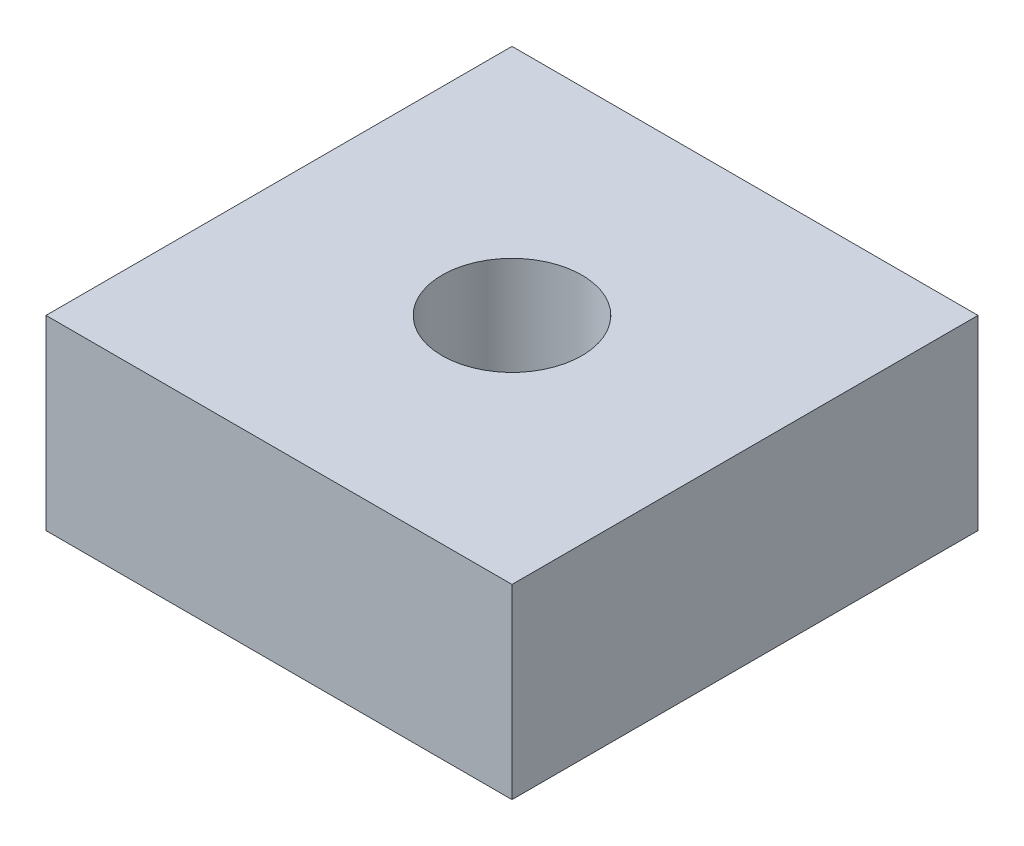
ISO-10303-21;
HEADER;
FILE_DESCRIPTION(('STEP AP214'),'2;1');
FILE_NAME('part.step','',(''),(''),'','','');
FILE_SCHEMA(('AUTOMOTIVE_DESIGN { 1 0 10303 214 1 1 1 1 }'));
ENDSEC;
DATA;
#1=APPLICATION_CONTEXT('core data for automotive mechanical design processes');
#2=APPLICATION_PROTOCOL_DEFINITION('international standard','automotive_design',2000,#1);
#3=PRODUCT_CONTEXT('',#1,'mechanical');
#4=PRODUCT('Part','Part','',(#3));
#5=PRODUCT_RELATED_PRODUCT_CATEGORY('part','',(#4));
#6=PRODUCT_DEFINITION_FORMATION('','',#4);
#7=PRODUCT_DEFINITION_CONTEXT('part definition',#1,'design');
#8=PRODUCT_DEFINITION('design','',#6,#7);
#9=PRODUCT_DEFINITION_SHAPE('','',#8);
#10=(LENGTH_UNIT() NAMED_UNIT(*) SI_UNIT(.MILLI.,.METRE.));
#11=(NAMED_UNIT(*) PLANE_ANGLE_UNIT() SI_UNIT($,.RADIAN.));
#12=(NAMED_UNIT(*) SI_UNIT($,.STERADIAN.) SOLID_ANGLE_UNIT());
#13=UNCERTAINTY_MEASURE_WITH_UNIT(LENGTH_MEASURE(1.E-05),#10,'distance_accuracy_value','');
#14=(GEOMETRIC_REPRESENTATION_CONTEXT(3) GLOBAL_UNCERTAINTY_ASSIGNED_CONTEXT((#13)) GLOBAL_UNIT_ASSIGNED_CONTEXT((#10,
#11,#12)) REPRESENTATION_CONTEXT('',''));
#15=CARTESIAN_POINT('',(0.,0.,0.));
#16=DIRECTION('',(0.,0.,1.));
#17=DIRECTION('',(1.,0.,0.));
#18=AXIS2_PLACEMENT_3D('',#15,#16,#17);
#19=CARTESIAN_POINT('',(0.,4.,0.));
#20=DIRECTION('',(0.,1.,0.));
#21=DIRECTION('',(0.,0.,1.));
#22=AXIS2_PLACEMENT_3D('',#19,#20,#21);
#23=PLANE('',#22);
#24=DIRECTION('',(0.,0.,-1.));
#25=VECTOR('',#24,1.);
#26=CARTESIAN_POINT('',(5.,4.,-5.));
#27=LINE('',#26,#25);
#28=CARTESIAN_POINT('',(5.,4.,5.));
#29=VERTEX_POINT('',#28);
#30=CARTESIAN_POINT('',(5.,4.,-5.));
#31=VERTEX_POINT('',#30);
#32=EDGE_CURVE('E85',#29,#31,#27,.T.);
#33=ORIENTED_EDGE('',*,*,#32,.T.);
#34=DIRECTION('',(-1.,0.,0.));
#35=VECTOR('',#34,1.);
#36=CARTESIAN_POINT('',(-5.,4.,-5.));
#37=LINE('',#36,#35);
#38=CARTESIAN_POINT('',(-5.,4.,-5.));
#39=VERTEX_POINT('',#38);
#40=EDGE_CURVE('E80',#31,#39,#37,.T.);
#41=ORIENTED_EDGE('',*,*,#40,.T.);
#42=DIRECTION('',(0.,0.,1.));
#43=VECTOR('',#42,1.);
#44=CARTESIAN_POINT('',(-5.,4.,-5.));
#45=LINE('',#44,#43);
#46=CARTESIAN_POINT('',(-5.,4.,5.));
#47=VERTEX_POINT('',#46);
#48=EDGE_CURVE('E83',#39,#47,#45,.T.);
#49=ORIENTED_EDGE('',*,*,#48,.T.);
#50=DIRECTION('',(1.,0.,0.));
#51=VECTOR('',#50,1.);
#52=CARTESIAN_POINT('',(-5.,4.,5.));
#53=LINE('',#52,#51);
#54=EDGE_CURVE('E50',#47,#29,#53,.T.);
#55=ORIENTED_EDGE('',*,*,#54,.T.);
#56=EDGE_LOOP('',(#33,#41,#49,#55));
#57=FACE_BOUND('',#56,.T.);
#58=CARTESIAN_POINT('',(0.,4.,0.));
#59=DIRECTION('',(0.,1.,0.));
#60=DIRECTION('',(0.,0.,1.));
#61=AXIS2_PLACEMENT_3D('',#58,#59,#60);
#62=CIRCLE('',#61,1.5);
#63=CARTESIAN_POINT('',(0.,4.,1.5));
#64=VERTEX_POINT('',#63);
#65=EDGE_CURVE('E100',#64,#64,#62,.T.);
#66=ORIENTED_EDGE('',*,*,#65,.F.);
#67=EDGE_LOOP('',(#66));
#68=FACE_BOUND('',#67,.T.);
#69=ADVANCED_FACE('F33',(#57,#68),#23,.T.);
#70=CARTESIAN_POINT('',(0.,0.,0.));
#71=DIRECTION('',(0.,1.,0.));
#72=DIRECTION('',(0.,0.,1.));
#73=AXIS2_PLACEMENT_3D('',#70,#71,#72);
#74=PLANE('',#73);
#75=DIRECTION('',(0.,0.,-1.));
#76=VECTOR('',#75,1.);
#77=CARTESIAN_POINT('',(5.,0.,-5.));
#78=LINE('',#77,#76);
#79=CARTESIAN_POINT('',(5.,0.,5.));
#80=VERTEX_POINT('',#79);
#81=CARTESIAN_POINT('',(5.,0.,-5.));
#82=VERTEX_POINT('',#81);
#83=EDGE_CURVE('E97',#80,#82,#78,.T.);
#84=ORIENTED_EDGE('',*,*,#83,.F.);
#85=DIRECTION('',(1.,0.,0.));
#86=VECTOR('',#85,1.);
#87=CARTESIAN_POINT('',(-5.,0.,5.));
#88=LINE('',#87,#86);
#89=CARTESIAN_POINT('',(-5.,0.,5.));
#90=VERTEX_POINT('',#89);
#91=EDGE_CURVE('E73',#90,#80,#88,.T.);
#92=ORIENTED_EDGE('',*,*,#91,.F.);
#93=DIRECTION('',(0.,0.,1.));
#94=VECTOR('',#93,1.);
#95=CARTESIAN_POINT('',(-5.,0.,-5.));
#96=LINE('',#95,#94);
#97=CARTESIAN_POINT('',(-5.,0.,-5.));
#98=VERTEX_POINT('',#97);
#99=EDGE_CURVE('E67',#98,#90,#96,.T.);
#100=ORIENTED_EDGE('',*,*,#99,.F.);
#101=DIRECTION('',(-1.,0.,0.));
#102=VECTOR('',#101,1.);
#103=CARTESIAN_POINT('',(-5.,0.,-5.));
#104=LINE('',#103,#102);
#105=EDGE_CURVE('E89',#82,#98,#104,.T.);
#106=ORIENTED_EDGE('',*,*,#105,.F.);
#107=EDGE_LOOP('',(#84,#92,#100,#106));
#108=FACE_BOUND('',#107,.T.);
#109=CARTESIAN_POINT('',(0.,0.,0.));
#110=DIRECTION('',(0.,1.,0.));
#111=DIRECTION('',(0.,0.,1.));
#112=AXIS2_PLACEMENT_3D('',#109,#110,#111);
#113=CIRCLE('',#112,1.5);
#114=CARTESIAN_POINT('',(0.,0.,1.5));
#115=VERTEX_POINT('',#114);
#116=EDGE_CURVE('E112',#115,#115,#113,.T.);
#117=ORIENTED_EDGE('',*,*,#116,.T.);
#118=EDGE_LOOP('',(#117));
#119=FACE_BOUND('',#118,.T.);
#120=ADVANCED_FACE('F108',(#108,#119),#74,.F.);
#121=CARTESIAN_POINT('',(5.,4.,-5.));
#122=DIRECTION('',(-1.,0.,0.));
#123=DIRECTION('',(0.,0.,1.));
#124=AXIS2_PLACEMENT_3D('',#121,#122,#123);
#125=PLANE('',#124);
#126=ORIENTED_EDGE('',*,*,#83,.T.);
#127=DIRECTION('',(0.,-1.,0.));
#128=VECTOR('',#127,1.);
#129=CARTESIAN_POINT('',(5.,4.,-5.));
#130=LINE('',#129,#128);
#131=EDGE_CURVE('E11',#31,#82,#130,.T.);
#132=ORIENTED_EDGE('',*,*,#131,.F.);
#133=ORIENTED_EDGE('',*,*,#32,.F.);
#134=DIRECTION('',(0.,-1.,0.));
#135=VECTOR('',#134,1.);
#136=CARTESIAN_POINT('',(5.,4.,5.));
#137=LINE('',#136,#135);
#138=EDGE_CURVE('E93',#29,#80,#137,.T.);
#139=ORIENTED_EDGE('',*,*,#138,.T.);
#140=EDGE_LOOP('',(#126,#132,#133,#139));
#141=FACE_BOUND('',#140,.T.);
#142=ADVANCED_FACE('F35',(#141),#125,.F.);
#143=CARTESIAN_POINT('',(-5.,4.,-5.));
#144=DIRECTION('',(0.,0.,1.));
#145=DIRECTION('',(1.,0.,0.));
#146=AXIS2_PLACEMENT_3D('',#143,#144,#145);
#147=PLANE('',#146);
#148=ORIENTED_EDGE('',*,*,#105,.T.);
#149=DIRECTION('',(0.,-1.,0.));
#150=VECTOR('',#149,1.);
#151=CARTESIAN_POINT('',(-5.,4.,-5.));
#152=LINE('',#151,#150);
#153=EDGE_CURVE('E42',#39,#98,#152,.T.);
#154=ORIENTED_EDGE('',*,*,#153,.F.);
#155=ORIENTED_EDGE('',*,*,#40,.F.);
#156=ORIENTED_EDGE('',*,*,#131,.T.);
#157=EDGE_LOOP('',(#148,#154,#155,#156));
#158=FACE_BOUND('',#157,.T.);
#159=ADVANCED_FACE('F88',(#158),#147,.F.);
#160=CARTESIAN_POINT('',(-5.,4.,-5.));
#161=DIRECTION('',(1.,0.,0.));
#162=DIRECTION('',(0.,0.,-1.));
#163=AXIS2_PLACEMENT_3D('',#160,#161,#162);
#164=PLANE('',#163);
#165=ORIENTED_EDGE('',*,*,#99,.T.);
#166=DIRECTION('',(0.,-1.,0.));
#167=VECTOR('',#166,1.);
#168=CARTESIAN_POINT('',(-5.,4.,5.));
#169=LINE('',#168,#167);
#170=EDGE_CURVE('E90',#47,#90,#169,.T.);
#171=ORIENTED_EDGE('',*,*,#170,.F.);
#172=ORIENTED_EDGE('',*,*,#48,.F.);
#173=ORIENTED_EDGE('',*,*,#153,.T.);
#174=EDGE_LOOP('',(#165,#171,#172,#173));
#175=FACE_BOUND('',#174,.T.);
#176=ADVANCED_FACE('F91',(#175),#164,.F.);
#177=CARTESIAN_POINT('',(-5.,4.,5.));
#178=DIRECTION('',(0.,0.,-1.));
#179=DIRECTION('',(-1.,0.,0.));
#180=AXIS2_PLACEMENT_3D('',#177,#178,#179);
#181=PLANE('',#180);
#182=ORIENTED_EDGE('',*,*,#91,.T.);
#183=ORIENTED_EDGE('',*,*,#138,.F.);
#184=ORIENTED_EDGE('',*,*,#54,.F.);
#185=ORIENTED_EDGE('',*,*,#170,.T.);
#186=EDGE_LOOP('',(#182,#183,#184,#185));
#187=FACE_BOUND('',#186,.T.);
#188=ADVANCED_FACE('F105',(#187),#181,.F.);
#189=CARTESIAN_POINT('',(0.,4.,0.));
#190=DIRECTION('',(0.,-1.,0.));
#191=DIRECTION('',(0.,0.,-1.));
#192=AXIS2_PLACEMENT_3D('',#189,#190,#191);
#193=CYLINDRICAL_SURFACE('',#192,1.5);
#194=ORIENTED_EDGE('',*,*,#65,.T.);
#195=EDGE_LOOP('',(#194));
#196=FACE_BOUND('',#195,.T.);
#197=ORIENTED_EDGE('',*,*,#116,.F.);
#198=EDGE_LOOP('',(#197));
#199=FACE_BOUND('',#198,.T.);
#200=ADVANCED_FACE('F118',(#196,#199),#193,.F.);
#201=CLOSED_SHELL('',(#69,#120,#142,#159,#176,#188,#200));
#202=MANIFOLD_SOLID_BREP('B2',#201);
#203=ADVANCED_BREP_SHAPE_REPRESENTATION('',(#18,#202),#14);
#204=SHAPE_DEFINITION_REPRESENTATION(#9,#203);
ENDSEC;
END-ISO-10303-21;
